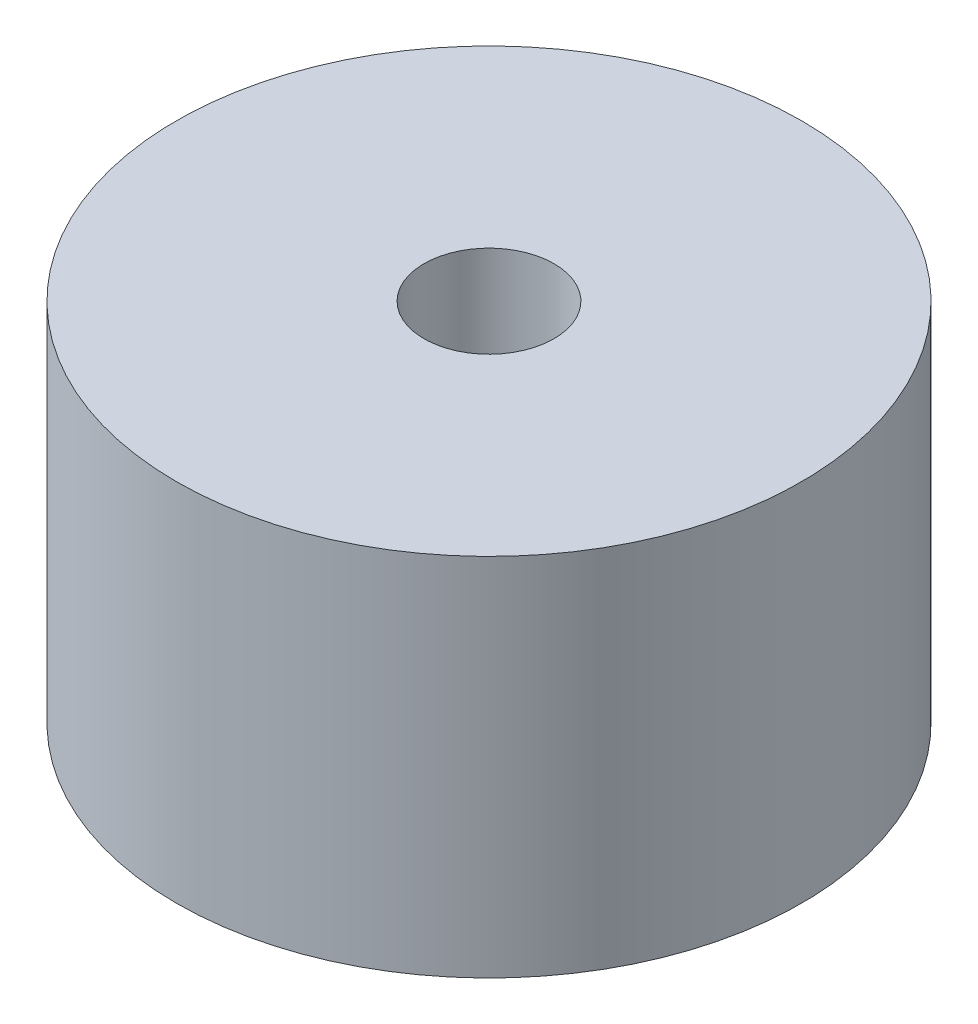
ISO-10303-21;
HEADER;
FILE_DESCRIPTION(('STEP AP214'),'2;1');
FILE_NAME('part.step','',(''),(''),'','','');
FILE_SCHEMA(('AUTOMOTIVE_DESIGN { 1 0 10303 214 1 1 1 1 }'));
ENDSEC;
DATA;
#1=APPLICATION_CONTEXT('core data for automotive mechanical design processes');
#2=APPLICATION_PROTOCOL_DEFINITION('international standard','automotive_design',2000,#1);
#3=PRODUCT_CONTEXT('',#1,'mechanical');
#4=PRODUCT('Part','Part','',(#3));
#5=PRODUCT_RELATED_PRODUCT_CATEGORY('part','',(#4));
#6=PRODUCT_DEFINITION_FORMATION('','',#4);
#7=PRODUCT_DEFINITION_CONTEXT('part definition',#1,'design');
#8=PRODUCT_DEFINITION('design','',#6,#7);
#9=PRODUCT_DEFINITION_SHAPE('','',#8);
#10=(LENGTH_UNIT() NAMED_UNIT(*) SI_UNIT(.MILLI.,.METRE.));
#11=(NAMED_UNIT(*) PLANE_ANGLE_UNIT() SI_UNIT($,.RADIAN.));
#12=(NAMED_UNIT(*) SI_UNIT($,.STERADIAN.) SOLID_ANGLE_UNIT());
#13=UNCERTAINTY_MEASURE_WITH_UNIT(LENGTH_MEASURE(1.E-05),#10,'distance_accuracy_value','');
#14=(GEOMETRIC_REPRESENTATION_CONTEXT(3) GLOBAL_UNCERTAINTY_ASSIGNED_CONTEXT((#13)) GLOBAL_UNIT_ASSIGNED_CONTEXT((#10,
#11,#12)) REPRESENTATION_CONTEXT('',''));
#15=CARTESIAN_POINT('',(0.,0.,0.));
#16=DIRECTION('',(0.,0.,1.));
#17=DIRECTION('',(1.,0.,0.));
#18=AXIS2_PLACEMENT_3D('',#15,#16,#17);
#19=CARTESIAN_POINT('',(0.,14.6,0.));
#20=DIRECTION('',(0.,-1.,0.));
#21=DIRECTION('',(0.,0.,-1.));
#22=AXIS2_PLACEMENT_3D('',#19,#20,#21);
#23=CYLINDRICAL_SURFACE('',#22,12.5);
#24=CARTESIAN_POINT('',(0.,14.6,0.));
#25=DIRECTION('',(0.,1.,0.));
#26=DIRECTION('',(0.,0.,1.));
#27=AXIS2_PLACEMENT_3D('',#24,#25,#26);
#28=CIRCLE('',#27,12.5);
#29=CARTESIAN_POINT('',(0.,14.6,12.5));
#30=VERTEX_POINT('',#29);
#31=EDGE_CURVE('E10',#30,#30,#28,.T.);
#32=ORIENTED_EDGE('',*,*,#31,.F.);
#33=EDGE_LOOP('',(#32));
#34=FACE_BOUND('',#33,.T.);
#35=CARTESIAN_POINT('',(0.,0.,0.));
#36=DIRECTION('',(0.,1.,0.));
#37=DIRECTION('',(0.,0.,1.));
#38=AXIS2_PLACEMENT_3D('',#35,#36,#37);
#39=CIRCLE('',#38,12.5);
#40=CARTESIAN_POINT('',(0.,0.,12.5));
#41=VERTEX_POINT('',#40);
#42=EDGE_CURVE('E35',#41,#41,#39,.T.);
#43=ORIENTED_EDGE('',*,*,#42,.T.);
#44=EDGE_LOOP('',(#43));
#45=FACE_BOUND('',#44,.T.);
#46=ADVANCED_FACE('F32',(#34,#45),#23,.T.);
#47=CARTESIAN_POINT('',(0.,14.6,0.));
#48=DIRECTION('',(0.,1.,0.));
#49=DIRECTION('',(0.,0.,1.));
#50=AXIS2_PLACEMENT_3D('',#47,#48,#49);
#51=PLANE('',#50);
#52=CARTESIAN_POINT('',(0.,14.6,0.));
#53=DIRECTION('',(0.,-1.,0.));
#54=DIRECTION('',(0.,0.,-1.));
#55=AXIS2_PLACEMENT_3D('',#52,#53,#54);
#56=CIRCLE('',#55,2.6);
#57=CARTESIAN_POINT('',(0.,14.6,-2.6));
#58=VERTEX_POINT('',#57);
#59=EDGE_CURVE('E42',#58,#58,#56,.T.);
#60=ORIENTED_EDGE('',*,*,#59,.T.);
#61=EDGE_LOOP('',(#60));
#62=FACE_BOUND('',#61,.T.);
#63=ORIENTED_EDGE('',*,*,#31,.T.);
#64=EDGE_LOOP('',(#63));
#65=FACE_BOUND('',#64,.T.);
#66=ADVANCED_FACE('F50',(#62,#65),#51,.T.);
#67=CARTESIAN_POINT('',(0.,0.,0.));
#68=DIRECTION('',(0.,1.,0.));
#69=DIRECTION('',(0.,0.,1.));
#70=AXIS2_PLACEMENT_3D('',#67,#68,#69);
#71=PLANE('',#70);
#72=CARTESIAN_POINT('',(0.,0.,0.));
#73=DIRECTION('',(0.,-1.,0.));
#74=DIRECTION('',(0.,0.,-1.));
#75=AXIS2_PLACEMENT_3D('',#72,#73,#74);
#76=CIRCLE('',#75,2.6);
#77=CARTESIAN_POINT('',(0.,0.,-2.6));
#78=VERTEX_POINT('',#77);
#79=EDGE_CURVE('E44',#78,#78,#76,.T.);
#80=ORIENTED_EDGE('',*,*,#79,.F.);
#81=EDGE_LOOP('',(#80));
#82=FACE_BOUND('',#81,.T.);
#83=ORIENTED_EDGE('',*,*,#42,.F.);
#84=EDGE_LOOP('',(#83));
#85=FACE_BOUND('',#84,.T.);
#86=ADVANCED_FACE('F55',(#82,#85),#71,.F.);
#87=CARTESIAN_POINT('',(0.,14.6,0.));
#88=DIRECTION('',(0.,-1.,0.));
#89=DIRECTION('',(0.,0.,-1.));
#90=AXIS2_PLACEMENT_3D('',#87,#88,#89);
#91=CYLINDRICAL_SURFACE('',#90,2.6);
#92=ORIENTED_EDGE('',*,*,#59,.F.);
#93=EDGE_LOOP('',(#92));
#94=FACE_BOUND('',#93,.T.);
#95=ORIENTED_EDGE('',*,*,#79,.T.);
#96=EDGE_LOOP('',(#95));
#97=FACE_BOUND('',#96,.T.);
#98=ADVANCED_FACE('F52',(#94,#97),#91,.F.);
#99=CLOSED_SHELL('',(#46,#66,#86,#98));
#100=MANIFOLD_SOLID_BREP('B2',#99);
#101=ADVANCED_BREP_SHAPE_REPRESENTATION('',(#18,#100),#14);
#102=SHAPE_DEFINITION_REPRESENTATION(#9,#101);
ENDSEC;
END-ISO-10303-21;
